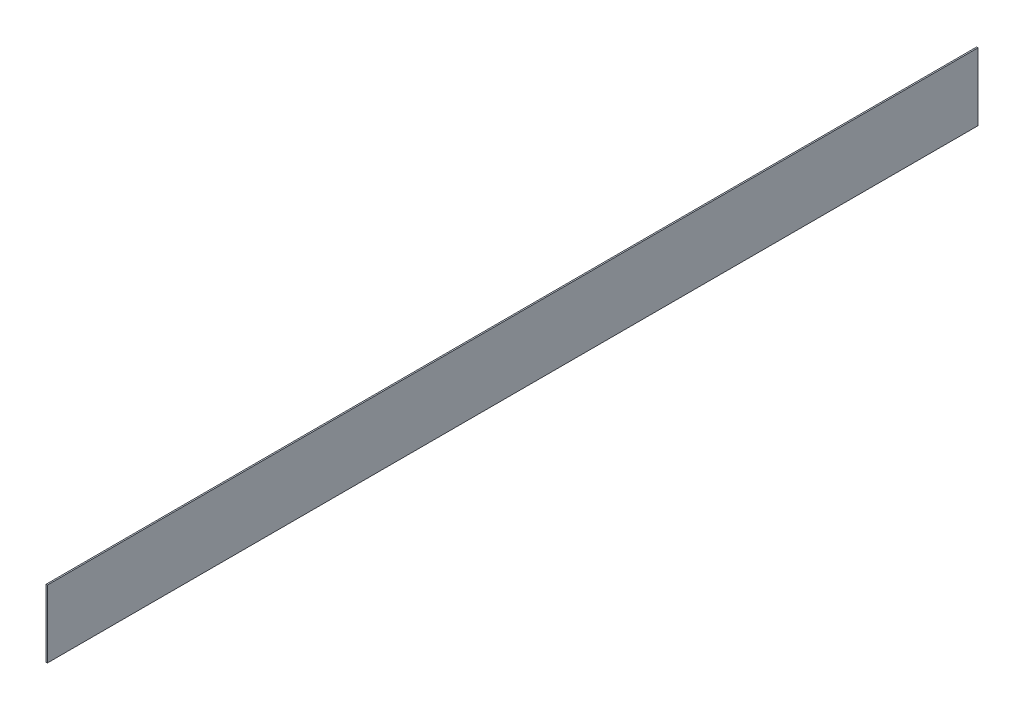
ISO-10303-21;
HEADER;
FILE_DESCRIPTION(('STEP AP214'),'2;1');
FILE_NAME('part.step','',(''),(''),'','','');
FILE_SCHEMA(('AUTOMOTIVE_DESIGN { 1 0 10303 214 1 1 1 1 }'));
ENDSEC;
DATA;
#1=APPLICATION_CONTEXT('core data for automotive mechanical design processes');
#2=APPLICATION_PROTOCOL_DEFINITION('international standard','automotive_design',2000,#1);
#3=PRODUCT_CONTEXT('',#1,'mechanical');
#4=PRODUCT('Part','Part','',(#3));
#5=PRODUCT_RELATED_PRODUCT_CATEGORY('part','',(#4));
#6=PRODUCT_DEFINITION_FORMATION('','',#4);
#7=PRODUCT_DEFINITION_CONTEXT('part definition',#1,'design');
#8=PRODUCT_DEFINITION('design','',#6,#7);
#9=PRODUCT_DEFINITION_SHAPE('','',#8);
#10=(LENGTH_UNIT() NAMED_UNIT(*) SI_UNIT(.MILLI.,.METRE.));
#11=(NAMED_UNIT(*) PLANE_ANGLE_UNIT() SI_UNIT($,.RADIAN.));
#12=(NAMED_UNIT(*) SI_UNIT($,.STERADIAN.) SOLID_ANGLE_UNIT());
#13=UNCERTAINTY_MEASURE_WITH_UNIT(LENGTH_MEASURE(1.E-05),#10,'distance_accuracy_value','');
#14=(GEOMETRIC_REPRESENTATION_CONTEXT(3) GLOBAL_UNCERTAINTY_ASSIGNED_CONTEXT((#13)) GLOBAL_UNIT_ASSIGNED_CONTEXT((#10,
#11,#12)) REPRESENTATION_CONTEXT('',''));
#15=CARTESIAN_POINT('',(0.,0.,0.));
#16=DIRECTION('',(0.,0.,1.));
#17=DIRECTION('',(1.,0.,0.));
#18=AXIS2_PLACEMENT_3D('',#15,#16,#17);
#19=CARTESIAN_POINT('',(823.,-991.,1915.));
#20=DIRECTION('',(1.,0.,0.));
#21=DIRECTION('',(0.,0.,1.));
#22=AXIS2_PLACEMENT_3D('',#19,#20,#21);
#23=PLANE('',#22);
#24=DIRECTION('',(0.,-1.,0.));
#25=VECTOR('',#24,1.);
#26=CARTESIAN_POINT('',(823.,-920.,1733.));
#27=LINE('',#26,#25);
#28=CARTESIAN_POINT('',(823.,-920.,1733.));
#29=VERTEX_POINT('',#28);
#30=CARTESIAN_POINT('',(823.,-985.,1733.));
#31=VERTEX_POINT('',#30);
#32=EDGE_CURVE('E11',#29,#31,#27,.T.);
#33=ORIENTED_EDGE('',*,*,#32,.T.);
#34=DIRECTION('',(0.,0.,-1.));
#35=VECTOR('',#34,1.);
#36=CARTESIAN_POINT('',(823.,-985.,1733.));
#37=LINE('',#36,#35);
#38=CARTESIAN_POINT('',(823.,-985.,837.));
#39=VERTEX_POINT('',#38);
#40=EDGE_CURVE('E27',#31,#39,#37,.T.);
#41=ORIENTED_EDGE('',*,*,#40,.T.);
#42=DIRECTION('',(0.,1.,0.));
#43=VECTOR('',#42,1.);
#44=CARTESIAN_POINT('',(823.,-985.,837.));
#45=LINE('',#44,#43);
#46=CARTESIAN_POINT('',(823.,-920.,837.));
#47=VERTEX_POINT('',#46);
#48=EDGE_CURVE('E113',#39,#47,#45,.T.);
#49=ORIENTED_EDGE('',*,*,#48,.T.);
#50=DIRECTION('',(0.,0.,1.));
#51=VECTOR('',#50,1.);
#52=CARTESIAN_POINT('',(823.,-920.,837.));
#53=LINE('',#52,#51);
#54=EDGE_CURVE('E110',#47,#29,#53,.T.);
#55=ORIENTED_EDGE('',*,*,#54,.T.);
#56=EDGE_LOOP('',(#33,#41,#49,#55));
#57=FACE_BOUND('',#56,.T.);
#58=ADVANCED_FACE('F17',(#57),#23,.T.);
#59=CARTESIAN_POINT('',(823.,-920.,837.));
#60=DIRECTION('',(0.,1.,0.));
#61=DIRECTION('',(0.,0.,-1.));
#62=AXIS2_PLACEMENT_3D('',#59,#60,#61);
#63=PLANE('',#62);
#64=DIRECTION('',(-1.,0.,0.));
#65=VECTOR('',#64,1.);
#66=CARTESIAN_POINT('',(823.,-920.,1733.));
#67=LINE('',#66,#65);
#68=CARTESIAN_POINT('',(821.7,-920.,1733.));
#69=VERTEX_POINT('',#68);
#70=EDGE_CURVE('E81',#29,#69,#67,.T.);
#71=ORIENTED_EDGE('',*,*,#70,.F.);
#72=ORIENTED_EDGE('',*,*,#54,.F.);
#73=DIRECTION('',(-1.,0.,0.));
#74=VECTOR('',#73,1.);
#75=CARTESIAN_POINT('',(823.,-920.,837.));
#76=LINE('',#75,#74);
#77=CARTESIAN_POINT('',(821.7,-920.,837.));
#78=VERTEX_POINT('',#77);
#79=EDGE_CURVE('E114',#47,#78,#76,.T.);
#80=ORIENTED_EDGE('',*,*,#79,.T.);
#81=DIRECTION('',(0.,0.,-1.));
#82=VECTOR('',#81,1.);
#83=CARTESIAN_POINT('',(821.7,-920.,1733.));
#84=LINE('',#83,#82);
#85=EDGE_CURVE('E94',#69,#78,#84,.T.);
#86=ORIENTED_EDGE('',*,*,#85,.F.);
#87=EDGE_LOOP('',(#71,#72,#80,#86));
#88=FACE_BOUND('',#87,.T.);
#89=ADVANCED_FACE('F135',(#88),#63,.T.);
#90=CARTESIAN_POINT('',(821.35,-920.35,1285.));
#91=DIRECTION('',(-0.707106781186548,0.707106781186548,0.));
#92=DIRECTION('',(-0.707106781186548,-0.707106781186548,0.));
#93=AXIS2_PLACEMENT_3D('',#90,#91,#92);
#94=PLANE('',#93);
#95=DIRECTION('',(-0.577350269189626,-0.577350269189626,0.577350269189626));
#96=VECTOR('',#95,1.);
#97=CARTESIAN_POINT('',(821.7,-920.,837.));
#98=LINE('',#97,#96);
#99=CARTESIAN_POINT('',(821.,-920.7,837.7));
#100=VERTEX_POINT('',#99);
#101=EDGE_CURVE('E116',#78,#100,#98,.T.);
#102=ORIENTED_EDGE('',*,*,#101,.T.);
#103=DIRECTION('',(0.,0.,-1.));
#104=VECTOR('',#103,1.);
#105=CARTESIAN_POINT('',(821.,-920.7,1732.3));
#106=LINE('',#105,#104);
#107=CARTESIAN_POINT('',(821.,-920.7,1732.3));
#108=VERTEX_POINT('',#107);
#109=EDGE_CURVE('E65',#108,#100,#106,.T.);
#110=ORIENTED_EDGE('',*,*,#109,.F.);
#111=DIRECTION('',(-0.577350269189626,-0.577350269189626,-0.577350269189626));
#112=VECTOR('',#111,1.);
#113=CARTESIAN_POINT('',(821.7,-920.,1733.));
#114=LINE('',#113,#112);
#115=EDGE_CURVE('E95',#69,#108,#114,.T.);
#116=ORIENTED_EDGE('',*,*,#115,.F.);
#117=ORIENTED_EDGE('',*,*,#85,.T.);
#118=EDGE_LOOP('',(#102,#110,#116,#117));
#119=FACE_BOUND('',#118,.T.);
#120=ADVANCED_FACE('F145',(#119),#94,.T.);
#121=CARTESIAN_POINT('',(821.35,-952.5,1732.65));
#122=DIRECTION('',(-0.707106781186498,0.,0.707106781186598));
#123=DIRECTION('',(0.,-1.,0.));
#124=AXIS2_PLACEMENT_3D('',#121,#122,#123);
#125=PLANE('',#124);
#126=DIRECTION('',(-0.577350269189626,0.577350269189626,-0.577350269189626));
#127=VECTOR('',#126,1.);
#128=CARTESIAN_POINT('',(821.7,-985.,1733.));
#129=LINE('',#128,#127);
#130=CARTESIAN_POINT('',(821.7,-985.,1733.));
#131=VERTEX_POINT('',#130);
#132=CARTESIAN_POINT('',(821.,-984.3,1732.3));
#133=VERTEX_POINT('',#132);
#134=EDGE_CURVE('E71',#131,#133,#129,.T.);
#135=ORIENTED_EDGE('',*,*,#134,.F.);
#136=DIRECTION('',(0.,1.,0.));
#137=VECTOR('',#136,1.);
#138=CARTESIAN_POINT('',(821.7,-985.,1733.));
#139=LINE('',#138,#137);
#140=EDGE_CURVE('E74',#131,#69,#139,.T.);
#141=ORIENTED_EDGE('',*,*,#140,.T.);
#142=ORIENTED_EDGE('',*,*,#115,.T.);
#143=DIRECTION('',(0.,1.,0.));
#144=VECTOR('',#143,1.);
#145=CARTESIAN_POINT('',(821.,-984.3,1732.3));
#146=LINE('',#145,#144);
#147=EDGE_CURVE('E76',#133,#108,#146,.T.);
#148=ORIENTED_EDGE('',*,*,#147,.F.);
#149=EDGE_LOOP('',(#135,#141,#142,#148));
#150=FACE_BOUND('',#149,.T.);
#151=ADVANCED_FACE('F72',(#150),#125,.T.);
#152=CARTESIAN_POINT('',(821.,-991.,1915.));
#153=DIRECTION('',(1.,0.,0.));
#154=DIRECTION('',(0.,0.,1.));
#155=AXIS2_PLACEMENT_3D('',#152,#153,#154);
#156=PLANE('',#155);
#157=DIRECTION('',(0.,0.,1.));
#158=VECTOR('',#157,1.);
#159=CARTESIAN_POINT('',(821.,-984.3,837.7));
#160=LINE('',#159,#158);
#161=CARTESIAN_POINT('',(821.,-984.3,837.7));
#162=VERTEX_POINT('',#161);
#163=EDGE_CURVE('E101',#162,#133,#160,.T.);
#164=ORIENTED_EDGE('',*,*,#163,.T.);
#165=ORIENTED_EDGE('',*,*,#147,.T.);
#166=ORIENTED_EDGE('',*,*,#109,.T.);
#167=DIRECTION('',(0.,-1.,0.));
#168=VECTOR('',#167,1.);
#169=CARTESIAN_POINT('',(821.,-920.7,837.7));
#170=LINE('',#169,#168);
#171=EDGE_CURVE('E105',#100,#162,#170,.T.);
#172=ORIENTED_EDGE('',*,*,#171,.T.);
#173=EDGE_LOOP('',(#164,#165,#166,#172));
#174=FACE_BOUND('',#173,.T.);
#175=ADVANCED_FACE('F129',(#174),#156,.F.);
#176=CARTESIAN_POINT('',(821.35,-952.5,837.35));
#177=DIRECTION('',(-0.707106781186598,0.,-0.707106781186498));
#178=DIRECTION('',(-0.707106781186498,0.,0.707106781186598));
#179=AXIS2_PLACEMENT_3D('',#176,#177,#178);
#180=PLANE('',#179);
#181=DIRECTION('',(-0.577350269189592,0.577350269189492,0.577350269189793));
#182=VECTOR('',#181,1.);
#183=CARTESIAN_POINT('',(821.7,-985.,837.));
#184=LINE('',#183,#182);
#185=CARTESIAN_POINT('',(821.7,-985.,837.));
#186=VERTEX_POINT('',#185);
#187=EDGE_CURVE('E100',#186,#162,#184,.T.);
#188=ORIENTED_EDGE('',*,*,#187,.T.);
#189=ORIENTED_EDGE('',*,*,#171,.F.);
#190=ORIENTED_EDGE('',*,*,#101,.F.);
#191=DIRECTION('',(0.,-1.,0.));
#192=VECTOR('',#191,1.);
#193=CARTESIAN_POINT('',(821.7,-920.,837.));
#194=LINE('',#193,#192);
#195=EDGE_CURVE('E106',#78,#186,#194,.T.);
#196=ORIENTED_EDGE('',*,*,#195,.T.);
#197=EDGE_LOOP('',(#188,#189,#190,#196));
#198=FACE_BOUND('',#197,.T.);
#199=ADVANCED_FACE('F19',(#198),#180,.T.);
#200=CARTESIAN_POINT('',(823.,-985.,837.));
#201=DIRECTION('',(0.,0.,-1.));
#202=DIRECTION('',(0.,1.,0.));
#203=AXIS2_PLACEMENT_3D('',#200,#201,#202);
#204=PLANE('',#203);
#205=ORIENTED_EDGE('',*,*,#79,.F.);
#206=ORIENTED_EDGE('',*,*,#48,.F.);
#207=DIRECTION('',(-1.,0.,0.));
#208=VECTOR('',#207,1.);
#209=CARTESIAN_POINT('',(823.,-985.,837.));
#210=LINE('',#209,#208);
#211=EDGE_CURVE('E89',#39,#186,#210,.T.);
#212=ORIENTED_EDGE('',*,*,#211,.T.);
#213=ORIENTED_EDGE('',*,*,#195,.F.);
#214=EDGE_LOOP('',(#205,#206,#212,#213));
#215=FACE_BOUND('',#214,.T.);
#216=ADVANCED_FACE('F137',(#215),#204,.T.);
#217=CARTESIAN_POINT('',(823.,-985.,1733.));
#218=DIRECTION('',(0.,-1.,0.));
#219=DIRECTION('',(1.,0.,0.));
#220=AXIS2_PLACEMENT_3D('',#217,#218,#219);
#221=PLANE('',#220);
#222=ORIENTED_EDGE('',*,*,#211,.F.);
#223=ORIENTED_EDGE('',*,*,#40,.F.);
#224=DIRECTION('',(-1.,0.,0.));
#225=VECTOR('',#224,1.);
#226=CARTESIAN_POINT('',(823.,-985.,1733.));
#227=LINE('',#226,#225);
#228=EDGE_CURVE('E85',#31,#131,#227,.T.);
#229=ORIENTED_EDGE('',*,*,#228,.T.);
#230=DIRECTION('',(0.,0.,1.));
#231=VECTOR('',#230,1.);
#232=CARTESIAN_POINT('',(821.7,-985.,837.));
#233=LINE('',#232,#231);
#234=EDGE_CURVE('E21',#186,#131,#233,.T.);
#235=ORIENTED_EDGE('',*,*,#234,.F.);
#236=EDGE_LOOP('',(#222,#223,#229,#235));
#237=FACE_BOUND('',#236,.T.);
#238=ADVANCED_FACE('F86',(#237),#221,.T.);
#239=CARTESIAN_POINT('',(821.35,-984.65,1285.));
#240=DIRECTION('',(-0.707106781186548,-0.707106781186548,0.));
#241=DIRECTION('',(0.,0.,1.));
#242=AXIS2_PLACEMENT_3D('',#239,#240,#241);
#243=PLANE('',#242);
#244=ORIENTED_EDGE('',*,*,#187,.F.);
#245=ORIENTED_EDGE('',*,*,#234,.T.);
#246=ORIENTED_EDGE('',*,*,#134,.T.);
#247=ORIENTED_EDGE('',*,*,#163,.F.);
#248=EDGE_LOOP('',(#244,#245,#246,#247));
#249=FACE_BOUND('',#248,.T.);
#250=ADVANCED_FACE('F98',(#249),#243,.T.);
#251=CARTESIAN_POINT('',(823.,-920.,1733.));
#252=DIRECTION('',(0.,0.,1.));
#253=DIRECTION('',(1.,0.,0.));
#254=AXIS2_PLACEMENT_3D('',#251,#252,#253);
#255=PLANE('',#254);
#256=ORIENTED_EDGE('',*,*,#228,.F.);
#257=ORIENTED_EDGE('',*,*,#32,.F.);
#258=ORIENTED_EDGE('',*,*,#70,.T.);
#259=ORIENTED_EDGE('',*,*,#140,.F.);
#260=EDGE_LOOP('',(#256,#257,#258,#259));
#261=FACE_BOUND('',#260,.T.);
#262=ADVANCED_FACE('F92',(#261),#255,.T.);
#263=CLOSED_SHELL('',(#58,#89,#120,#151,#175,#199,#216,#238,#250,#262));
#264=MANIFOLD_SOLID_BREP('B1',#263);
#265=ADVANCED_BREP_SHAPE_REPRESENTATION('',(#18,#264),#14);
#266=SHAPE_DEFINITION_REPRESENTATION(#9,#265);
ENDSEC;
END-ISO-10303-21;
